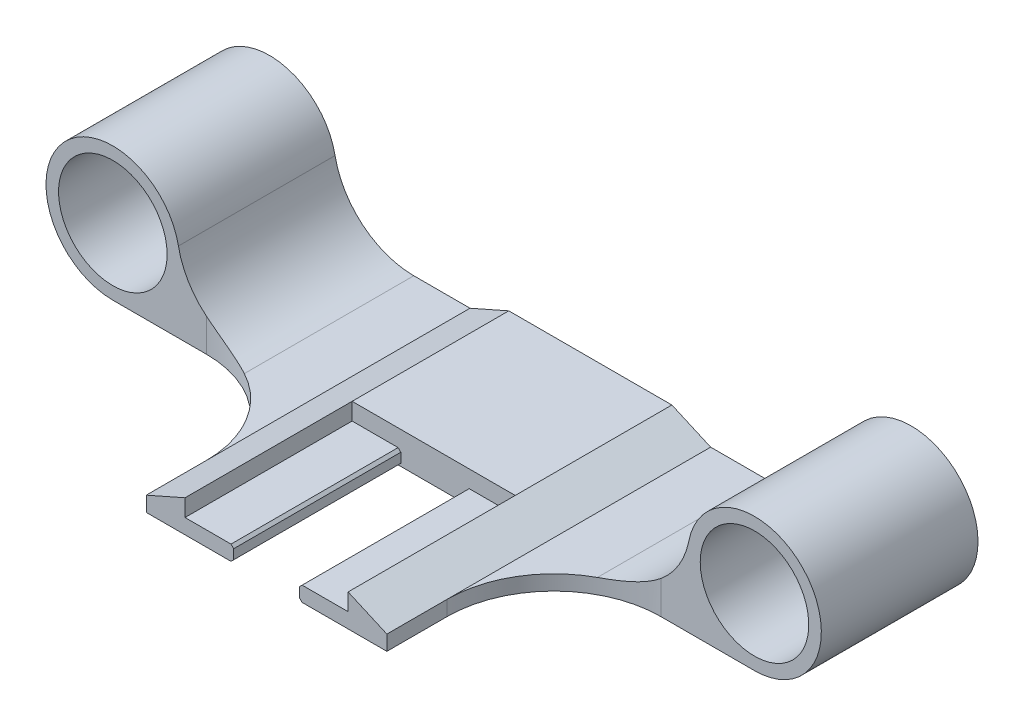
ISO-10303-21;
HEADER;
FILE_DESCRIPTION(('STEP AP214'),'2;1');
FILE_NAME('part.step','',(''),(''),'','','');
FILE_SCHEMA(('AUTOMOTIVE_DESIGN { 1 0 10303 214 1 1 1 1 }'));
ENDSEC;
DATA;
#1=APPLICATION_CONTEXT('core data for automotive mechanical design processes');
#2=APPLICATION_PROTOCOL_DEFINITION('international standard','automotive_design',2000,#1);
#3=PRODUCT_CONTEXT('',#1,'mechanical');
#4=PRODUCT('Part','Part','',(#3));
#5=PRODUCT_RELATED_PRODUCT_CATEGORY('part','',(#4));
#6=PRODUCT_DEFINITION_FORMATION('','',#4);
#7=PRODUCT_DEFINITION_CONTEXT('part definition',#1,'design');
#8=PRODUCT_DEFINITION('design','',#6,#7);
#9=PRODUCT_DEFINITION_SHAPE('','',#8);
#10=(LENGTH_UNIT() NAMED_UNIT(*) SI_UNIT(.MILLI.,.METRE.));
#11=(NAMED_UNIT(*) PLANE_ANGLE_UNIT() SI_UNIT($,.RADIAN.));
#12=(NAMED_UNIT(*) SI_UNIT($,.STERADIAN.) SOLID_ANGLE_UNIT());
#13=UNCERTAINTY_MEASURE_WITH_UNIT(LENGTH_MEASURE(1.E-05),#10,'distance_accuracy_value','');
#14=(GEOMETRIC_REPRESENTATION_CONTEXT(3) GLOBAL_UNCERTAINTY_ASSIGNED_CONTEXT((#13)) GLOBAL_UNIT_ASSIGNED_CONTEXT((#10,
#11,#12)) REPRESENTATION_CONTEXT('',''));
#15=CARTESIAN_POINT('',(0.,0.,0.));
#16=DIRECTION('',(0.,0.,1.));
#17=DIRECTION('',(1.,0.,0.));
#18=AXIS2_PLACEMENT_3D('',#15,#16,#17);
#19=CARTESIAN_POINT('',(22.5,-1.4,31.25));
#20=DIRECTION('',(-1.,0.,0.));
#21=DIRECTION('',(0.,0.,1.));
#22=AXIS2_PLACEMENT_3D('',#19,#20,#21);
#23=PLANE('',#22);
#24=DIRECTION('',(0.,0.,-1.));
#25=VECTOR('',#24,1.);
#26=CARTESIAN_POINT('',(22.5,-1.4,31.25));
#27=LINE('',#26,#25);
#28=CARTESIAN_POINT('',(22.5,-1.4,31.25));
#29=VERTEX_POINT('',#28);
#30=CARTESIAN_POINT('',(22.5,-1.4,20.));
#31=VERTEX_POINT('',#30);
#32=EDGE_CURVE('E409',#29,#31,#27,.T.);
#33=ORIENTED_EDGE('',*,*,#32,.T.);
#34=DIRECTION('',(0.,-1.,0.));
#35=VECTOR('',#34,1.);
#36=CARTESIAN_POINT('',(22.5,-1.4,20.));
#37=LINE('',#36,#35);
#38=CARTESIAN_POINT('',(22.5,1.4,20.));
#39=VERTEX_POINT('',#38);
#40=EDGE_CURVE('E432',#31,#39,#37,.F.);
#41=ORIENTED_EDGE('',*,*,#40,.T.);
#42=DIRECTION('',(0.,0.,-1.));
#43=VECTOR('',#42,1.);
#44=CARTESIAN_POINT('',(22.5,1.4,31.25));
#45=LINE('',#44,#43);
#46=CARTESIAN_POINT('',(22.5,1.4,31.25));
#47=VERTEX_POINT('',#46);
#48=EDGE_CURVE('E396',#47,#39,#45,.T.);
#49=ORIENTED_EDGE('',*,*,#48,.F.);
#50=DIRECTION('',(0.,1.,0.));
#51=VECTOR('',#50,1.);
#52=CARTESIAN_POINT('',(22.5,-1.4,31.25));
#53=LINE('',#52,#51);
#54=EDGE_CURVE('E393',#29,#47,#53,.T.);
#55=ORIENTED_EDGE('',*,*,#54,.F.);
#56=EDGE_LOOP('',(#33,#41,#49,#55));
#57=FACE_BOUND('',#56,.T.);
#58=ADVANCED_FACE('F41',(#57),#23,.F.);
#59=CARTESIAN_POINT('',(-22.5,-1.4,-29.3));
#60=DIRECTION('',(-1.,0.,0.));
#61=DIRECTION('',(0.,0.,1.));
#62=AXIS2_PLACEMENT_3D('',#59,#60,#61);
#63=PLANE('',#62);
#64=DIRECTION('',(0.,0.,1.));
#65=VECTOR('',#64,1.);
#66=CARTESIAN_POINT('',(-22.5,1.4,-29.3));
#67=LINE('',#66,#65);
#68=CARTESIAN_POINT('',(-22.5,1.4,20.));
#69=VERTEX_POINT('',#68);
#70=CARTESIAN_POINT('',(-22.5,1.4,31.25));
#71=VERTEX_POINT('',#70);
#72=EDGE_CURVE('E371',#69,#71,#67,.T.);
#73=ORIENTED_EDGE('',*,*,#72,.F.);
#74=DIRECTION('',(0.,-1.,0.));
#75=VECTOR('',#74,1.);
#76=CARTESIAN_POINT('',(-22.5,-1.4,20.));
#77=LINE('',#76,#75);
#78=CARTESIAN_POINT('',(-22.5,-1.4,20.));
#79=VERTEX_POINT('',#78);
#80=EDGE_CURVE('E421',#69,#79,#77,.T.);
#81=ORIENTED_EDGE('',*,*,#80,.T.);
#82=DIRECTION('',(0.,0.,1.));
#83=VECTOR('',#82,1.);
#84=CARTESIAN_POINT('',(-22.5,-1.4,-29.3));
#85=LINE('',#84,#83);
#86=CARTESIAN_POINT('',(-22.5,-1.4,31.25));
#87=VERTEX_POINT('',#86);
#88=EDGE_CURVE('E365',#79,#87,#85,.T.);
#89=ORIENTED_EDGE('',*,*,#88,.T.);
#90=DIRECTION('',(0.,-1.,0.));
#91=VECTOR('',#90,1.);
#92=CARTESIAN_POINT('',(-22.5,-1.4,31.25));
#93=LINE('',#92,#91);
#94=EDGE_CURVE('E299',#71,#87,#93,.T.);
#95=ORIENTED_EDGE('',*,*,#94,.F.);
#96=EDGE_LOOP('',(#73,#81,#89,#95));
#97=FACE_BOUND('',#96,.T.);
#98=ADVANCED_FACE('F508',(#97),#63,.T.);
#99=CARTESIAN_POINT('',(0.,0.,0.));
#100=DIRECTION('',(0.,0.,-1.));
#101=DIRECTION('',(-1.,0.,0.));
#102=AXIS2_PLACEMENT_3D('',#99,#100,#101);
#103=PLANE('',#102);
#104=DIRECTION('',(0.,1.,0.));
#105=VECTOR('',#104,1.);
#106=CARTESIAN_POINT('',(-6.15,-1.4,0.));
#107=LINE('',#106,#105);
#108=CARTESIAN_POINT('',(-6.15,-0.899999999999999,0.));
#109=VERTEX_POINT('',#108);
#110=CARTESIAN_POINT('',(-6.15,0.9,0.));
#111=VERTEX_POINT('',#110);
#112=EDGE_CURVE('E292',#109,#111,#107,.T.);
#113=ORIENTED_EDGE('',*,*,#112,.F.);
#114=DIRECTION('',(0.707106781186548,0.707106781186547,0.));
#115=VECTOR('',#114,1.);
#116=CARTESIAN_POINT('',(-2.625,2.625,0.));
#117=LINE('',#116,#115);
#118=CARTESIAN_POINT('',(-6.65,-1.4,0.));
#119=VERTEX_POINT('',#118);
#120=EDGE_CURVE('E584',#109,#119,#117,.F.);
#121=ORIENTED_EDGE('',*,*,#120,.T.);
#122=DIRECTION('',(1.,0.,0.));
#123=VECTOR('',#122,1.);
#124=CARTESIAN_POINT('',(22.5,-1.4,0.));
#125=LINE('',#124,#123);
#126=CARTESIAN_POINT('',(6.65000000000001,-1.4,0.));
#127=VERTEX_POINT('',#126);
#128=EDGE_CURVE('E345',#119,#127,#125,.T.);
#129=ORIENTED_EDGE('',*,*,#128,.T.);
#130=DIRECTION('',(0.707106781186548,-0.707106781186548,0.));
#131=VECTOR('',#130,1.);
#132=CARTESIAN_POINT('',(2.625,2.625,0.));
#133=LINE('',#132,#131);
#134=CARTESIAN_POINT('',(6.15,-0.899999999999999,0.));
#135=VERTEX_POINT('',#134);
#136=EDGE_CURVE('E581',#127,#135,#133,.F.);
#137=ORIENTED_EDGE('',*,*,#136,.T.);
#138=DIRECTION('',(0.,-1.,0.));
#139=VECTOR('',#138,1.);
#140=CARTESIAN_POINT('',(6.15,-1.4,0.));
#141=LINE('',#140,#139);
#142=CARTESIAN_POINT('',(6.15,0.9,0.));
#143=VERTEX_POINT('',#142);
#144=EDGE_CURVE('E379',#143,#135,#141,.T.);
#145=ORIENTED_EDGE('',*,*,#144,.F.);
#146=DIRECTION('',(-0.707106781186548,-0.707106781186547,0.));
#147=VECTOR('',#146,1.);
#148=CARTESIAN_POINT('',(2.625,-2.625,0.));
#149=LINE('',#148,#147);
#150=CARTESIAN_POINT('',(6.65,1.4,0.));
#151=VERTEX_POINT('',#150);
#152=EDGE_CURVE('E50',#143,#151,#149,.F.);
#153=ORIENTED_EDGE('',*,*,#152,.T.);
#154=DIRECTION('',(-1.,0.,0.));
#155=VECTOR('',#154,1.);
#156=CARTESIAN_POINT('',(6.15,1.4,0.));
#157=LINE('',#156,#155);
#158=CARTESIAN_POINT('',(15.25,1.4,0.));
#159=VERTEX_POINT('',#158);
#160=EDGE_CURVE('E400',#159,#151,#157,.T.);
#161=ORIENTED_EDGE('',*,*,#160,.F.);
#162=DIRECTION('',(0.,-1.,0.));
#163=VECTOR('',#162,1.);
#164=CARTESIAN_POINT('',(15.25,1.4,0.));
#165=LINE('',#164,#163);
#166=CARTESIAN_POINT('',(15.25,4.6,0.));
#167=VERTEX_POINT('',#166);
#168=EDGE_CURVE('E364',#167,#159,#165,.T.);
#169=ORIENTED_EDGE('',*,*,#168,.F.);
#170=DIRECTION('',(-1.,0.,0.));
#171=VECTOR('',#170,1.);
#172=CARTESIAN_POINT('',(15.25,4.6,0.));
#173=LINE('',#172,#171);
#174=CARTESIAN_POINT('',(-15.25,4.6,0.));
#175=VERTEX_POINT('',#174);
#176=EDGE_CURVE('E339',#167,#175,#173,.T.);
#177=ORIENTED_EDGE('',*,*,#176,.T.);
#178=DIRECTION('',(0.,1.,0.));
#179=VECTOR('',#178,1.);
#180=CARTESIAN_POINT('',(-15.25,1.4,0.));
#181=LINE('',#180,#179);
#182=CARTESIAN_POINT('',(-15.25,1.4,0.));
#183=VERTEX_POINT('',#182);
#184=EDGE_CURVE('E304',#183,#175,#181,.T.);
#185=ORIENTED_EDGE('',*,*,#184,.F.);
#186=DIRECTION('',(-1.,0.,0.));
#187=VECTOR('',#186,1.);
#188=CARTESIAN_POINT('',(-15.25,1.4,0.));
#189=LINE('',#188,#187);
#190=CARTESIAN_POINT('',(-6.65,1.4,0.));
#191=VERTEX_POINT('',#190);
#192=EDGE_CURVE('E326',#191,#183,#189,.T.);
#193=ORIENTED_EDGE('',*,*,#192,.F.);
#194=DIRECTION('',(-0.707106781186548,0.707106781186547,0.));
#195=VECTOR('',#194,1.);
#196=CARTESIAN_POINT('',(-2.62499999999999,-2.625,0.));
#197=LINE('',#196,#195);
#198=EDGE_CURVE('E11',#191,#111,#197,.F.);
#199=ORIENTED_EDGE('',*,*,#198,.T.);
#200=EDGE_LOOP('',(#113,#121,#129,#137,#145,#153,#161,#169,#177,#185,#193,#199));
#201=FACE_BOUND('',#200,.T.);
#202=ADVANCED_FACE('F514',(#201),#103,.F.);
#203=CARTESIAN_POINT('',(15.25,4.6,31.25));
#204=DIRECTION('',(-0.403795534848537,-0.914849258641217,0.));
#205=DIRECTION('',(0.914849258641217,-0.403795534848537,0.));
#206=AXIS2_PLACEMENT_3D('',#203,#204,#205);
#207=PLANE('',#206);
#208=ORIENTED_EDGE('',*,*,#48,.T.);
#209=DIRECTION('',(0.,0.,1.));
#210=VECTOR('',#209,1.);
#211=CARTESIAN_POINT('',(22.5,1.4,-85.2016994374947));
#212=LINE('',#211,#210);
#213=CARTESIAN_POINT('',(22.5,1.4,-29.3));
#214=VERTEX_POINT('',#213);
#215=EDGE_CURVE('E244',#214,#39,#212,.T.);
#216=ORIENTED_EDGE('',*,*,#215,.F.);
#217=DIRECTION('',(-0.914849258641216,0.403795534848539,0.));
#218=VECTOR('',#217,1.);
#219=CARTESIAN_POINT('',(22.5,1.4,-29.3));
#220=LINE('',#219,#218);
#221=CARTESIAN_POINT('',(15.25,4.6,-29.3));
#222=VERTEX_POINT('',#221);
#223=EDGE_CURVE('E222',#214,#222,#220,.T.);
#224=ORIENTED_EDGE('',*,*,#223,.T.);
#225=DIRECTION('',(0.,0.,1.));
#226=VECTOR('',#225,1.);
#227=CARTESIAN_POINT('',(15.25,4.6,-29.3));
#228=LINE('',#227,#226);
#229=EDGE_CURVE('E360',#222,#167,#228,.T.);
#230=ORIENTED_EDGE('',*,*,#229,.T.);
#231=DIRECTION('',(0.,0.,-1.));
#232=VECTOR('',#231,1.);
#233=CARTESIAN_POINT('',(15.25,4.6,31.25));
#234=LINE('',#233,#232);
#235=CARTESIAN_POINT('',(15.25,4.6,31.25));
#236=VERTEX_POINT('',#235);
#237=EDGE_CURVE('E417',#236,#167,#234,.T.);
#238=ORIENTED_EDGE('',*,*,#237,.F.);
#239=DIRECTION('',(-0.914849258641217,0.403795534848537,0.));
#240=VECTOR('',#239,1.);
#241=CARTESIAN_POINT('',(15.25,4.6,31.25));
#242=LINE('',#241,#240);
#243=EDGE_CURVE('E374',#47,#236,#242,.T.);
#244=ORIENTED_EDGE('',*,*,#243,.F.);
#245=EDGE_LOOP('',(#208,#216,#224,#230,#238,#244));
#246=FACE_BOUND('',#245,.T.);
#247=ADVANCED_FACE('F463',(#246),#207,.F.);
#248=CARTESIAN_POINT('',(15.25,1.4,31.25));
#249=DIRECTION('',(1.,0.,0.));
#250=DIRECTION('',(0.,0.,-1.));
#251=AXIS2_PLACEMENT_3D('',#248,#249,#250);
#252=PLANE('',#251);
#253=ORIENTED_EDGE('',*,*,#168,.T.);
#254=DIRECTION('',(0.,0.,-1.));
#255=VECTOR('',#254,1.);
#256=CARTESIAN_POINT('',(15.25,1.4,31.25));
#257=LINE('',#256,#255);
#258=CARTESIAN_POINT('',(15.25,1.4,31.25));
#259=VERTEX_POINT('',#258);
#260=EDGE_CURVE('E413',#259,#159,#257,.T.);
#261=ORIENTED_EDGE('',*,*,#260,.F.);
#262=DIRECTION('',(0.,-1.,0.));
#263=VECTOR('',#262,1.);
#264=CARTESIAN_POINT('',(15.25,1.4,31.25));
#265=LINE('',#264,#263);
#266=EDGE_CURVE('E378',#236,#259,#265,.T.);
#267=ORIENTED_EDGE('',*,*,#266,.F.);
#268=ORIENTED_EDGE('',*,*,#237,.T.);
#269=EDGE_LOOP('',(#253,#261,#267,#268));
#270=FACE_BOUND('',#269,.T.);
#271=ADVANCED_FACE('F531',(#270),#252,.F.);
#272=CARTESIAN_POINT('',(6.15,1.4,31.25));
#273=DIRECTION('',(0.,-1.,0.));
#274=DIRECTION('',(0.,0.,-1.));
#275=AXIS2_PLACEMENT_3D('',#272,#273,#274);
#276=PLANE('',#275);
#277=ORIENTED_EDGE('',*,*,#160,.T.);
#278=DIRECTION('',(0.,0.,1.));
#279=VECTOR('',#278,1.);
#280=CARTESIAN_POINT('',(6.65,1.4,31.25));
#281=LINE('',#280,#279);
#282=CARTESIAN_POINT('',(6.65,1.4,31.25));
#283=VERTEX_POINT('',#282);
#284=EDGE_CURVE('E543',#151,#283,#281,.T.);
#285=ORIENTED_EDGE('',*,*,#284,.T.);
#286=DIRECTION('',(-1.,0.,0.));
#287=VECTOR('',#286,1.);
#288=CARTESIAN_POINT('',(6.15,1.4,31.25));
#289=LINE('',#288,#287);
#290=EDGE_CURVE('E382',#259,#283,#289,.T.);
#291=ORIENTED_EDGE('',*,*,#290,.F.);
#292=ORIENTED_EDGE('',*,*,#260,.T.);
#293=EDGE_LOOP('',(#277,#285,#291,#292));
#294=FACE_BOUND('',#293,.T.);
#295=ADVANCED_FACE('F528',(#294),#276,.F.);
#296=CARTESIAN_POINT('',(6.15,-1.4,31.25));
#297=DIRECTION('',(1.,0.,0.));
#298=DIRECTION('',(0.,0.,-1.));
#299=AXIS2_PLACEMENT_3D('',#296,#297,#298);
#300=PLANE('',#299);
#301=ORIENTED_EDGE('',*,*,#144,.T.);
#302=DIRECTION('',(0.,0.,1.));
#303=VECTOR('',#302,1.);
#304=CARTESIAN_POINT('',(6.15,-0.899999999999999,31.25));
#305=LINE('',#304,#303);
#306=CARTESIAN_POINT('',(6.15,-0.899999999999999,31.25));
#307=VERTEX_POINT('',#306);
#308=EDGE_CURVE('E555',#135,#307,#305,.T.);
#309=ORIENTED_EDGE('',*,*,#308,.T.);
#310=DIRECTION('',(0.,-1.,0.));
#311=VECTOR('',#310,1.);
#312=CARTESIAN_POINT('',(6.15,-1.4,31.25));
#313=LINE('',#312,#311);
#314=CARTESIAN_POINT('',(6.15,0.9,31.25));
#315=VERTEX_POINT('',#314);
#316=EDGE_CURVE('E386',#315,#307,#313,.T.);
#317=ORIENTED_EDGE('',*,*,#316,.F.);
#318=DIRECTION('',(0.,0.,-1.));
#319=VECTOR('',#318,1.);
#320=CARTESIAN_POINT('',(6.15,0.9,31.25));
#321=LINE('',#320,#319);
#322=EDGE_CURVE('E552',#315,#143,#321,.T.);
#323=ORIENTED_EDGE('',*,*,#322,.T.);
#324=EDGE_LOOP('',(#301,#309,#317,#323));
#325=FACE_BOUND('',#324,.T.);
#326=ADVANCED_FACE('F524',(#325),#300,.F.);
#327=CARTESIAN_POINT('',(6.15,-1.4,31.25));
#328=DIRECTION('',(0.,1.,0.));
#329=DIRECTION('',(0.,0.,1.));
#330=AXIS2_PLACEMENT_3D('',#327,#328,#329);
#331=PLANE('',#330);
#332=DIRECTION('',(1.,0.,0.));
#333=VECTOR('',#332,1.);
#334=CARTESIAN_POINT('',(6.15,-1.4,31.25));
#335=LINE('',#334,#333);
#336=CARTESIAN_POINT('',(6.65,-1.4,31.25));
#337=VERTEX_POINT('',#336);
#338=EDGE_CURVE('E390',#337,#29,#335,.T.);
#339=ORIENTED_EDGE('',*,*,#338,.F.);
#340=DIRECTION('',(0.,0.,-1.));
#341=VECTOR('',#340,1.);
#342=CARTESIAN_POINT('',(6.65,-1.4,31.25));
#343=LINE('',#342,#341);
#344=EDGE_CURVE('E597',#337,#127,#343,.T.);
#345=ORIENTED_EDGE('',*,*,#344,.T.);
#346=ORIENTED_EDGE('',*,*,#128,.F.);
#347=DIRECTION('',(0.,0.,1.));
#348=VECTOR('',#347,1.);
#349=CARTESIAN_POINT('',(-6.65,-1.4,31.25));
#350=LINE('',#349,#348);
#351=CARTESIAN_POINT('',(-6.65,-1.4,31.25));
#352=VERTEX_POINT('',#351);
#353=EDGE_CURVE('E481',#119,#352,#350,.T.);
#354=ORIENTED_EDGE('',*,*,#353,.T.);
#355=DIRECTION('',(1.,0.,0.));
#356=VECTOR('',#355,1.);
#357=CARTESIAN_POINT('',(-22.5,-1.4,31.25));
#358=LINE('',#357,#356);
#359=EDGE_CURVE('E303',#87,#352,#358,.T.);
#360=ORIENTED_EDGE('',*,*,#359,.F.);
#361=ORIENTED_EDGE('',*,*,#88,.F.);
#362=CARTESIAN_POINT('',(-42.5,-1.4,20.));
#363=DIRECTION('',(0.,1.,0.));
#364=DIRECTION('',(0.,0.,1.));
#365=AXIS2_PLACEMENT_3D('',#362,#363,#364);
#366=CIRCLE('',#365,20.);
#367=CARTESIAN_POINT('',(-42.5,-1.4,0.));
#368=VERTEX_POINT('',#367);
#369=EDGE_CURVE('E436',#79,#368,#366,.T.);
#370=ORIENTED_EDGE('',*,*,#369,.T.);
#371=DIRECTION('',(1.,0.,0.));
#372=VECTOR('',#371,1.);
#373=CARTESIAN_POINT('',(0.,-1.4,0.));
#374=LINE('',#373,#372);
#375=CARTESIAN_POINT('',(-60.,-1.4,0.));
#376=VERTEX_POINT('',#375);
#377=EDGE_CURVE('E265',#376,#368,#374,.T.);
#378=ORIENTED_EDGE('',*,*,#377,.F.);
#379=DIRECTION('',(0.,0.,1.));
#380=VECTOR('',#379,1.);
#381=CARTESIAN_POINT('',(-60.,-1.4,-85.2016994374947));
#382=LINE('',#381,#380);
#383=CARTESIAN_POINT('',(-60.,-1.4,-29.3));
#384=VERTEX_POINT('',#383);
#385=EDGE_CURVE('E264',#384,#376,#382,.T.);
#386=ORIENTED_EDGE('',*,*,#385,.F.);
#387=DIRECTION('',(1.,0.,0.));
#388=VECTOR('',#387,1.);
#389=CARTESIAN_POINT('',(22.5,-1.4,-29.3));
#390=LINE('',#389,#388);
#391=CARTESIAN_POINT('',(60.,-1.4,-29.3));
#392=VERTEX_POINT('',#391);
#393=EDGE_CURVE('E349',#384,#392,#390,.T.);
#394=ORIENTED_EDGE('',*,*,#393,.T.);
#395=DIRECTION('',(0.,0.,1.));
#396=VECTOR('',#395,1.);
#397=CARTESIAN_POINT('',(60.,-1.4,-85.2016994374947));
#398=LINE('',#397,#396);
#399=CARTESIAN_POINT('',(60.,-1.4,0.));
#400=VERTEX_POINT('',#399);
#401=EDGE_CURVE('E249',#392,#400,#398,.T.);
#402=ORIENTED_EDGE('',*,*,#401,.T.);
#403=DIRECTION('',(-1.,0.,0.));
#404=VECTOR('',#403,1.);
#405=CARTESIAN_POINT('',(0.,-1.4,0.));
#406=LINE('',#405,#404);
#407=CARTESIAN_POINT('',(42.5,-1.4,0.));
#408=VERTEX_POINT('',#407);
#409=EDGE_CURVE('E901',#400,#408,#406,.T.);
#410=ORIENTED_EDGE('',*,*,#409,.T.);
#411=CARTESIAN_POINT('',(42.5,-1.4,20.));
#412=DIRECTION('',(0.,1.,0.));
#413=DIRECTION('',(0.,0.,1.));
#414=AXIS2_PLACEMENT_3D('',#411,#412,#413);
#415=CIRCLE('',#414,20.);
#416=EDGE_CURVE('E609',#408,#31,#415,.T.);
#417=ORIENTED_EDGE('',*,*,#416,.T.);
#418=ORIENTED_EDGE('',*,*,#32,.F.);
#419=EDGE_LOOP('',(#339,#345,#346,#354,#360,#361,#370,#378,#386,#394,#402,#410,#417,#418));
#420=FACE_BOUND('',#419,.T.);
#421=ADVANCED_FACE('F521',(#420),#331,.F.);
#422=CARTESIAN_POINT('',(0.,0.,31.25));
#423=DIRECTION('',(0.,0.,1.));
#424=DIRECTION('',(1.,0.,0.));
#425=AXIS2_PLACEMENT_3D('',#422,#423,#424);
#426=PLANE('',#425);
#427=ORIENTED_EDGE('',*,*,#316,.T.);
#428=DIRECTION('',(-0.707106781186548,0.707106781186548,0.));
#429=VECTOR('',#428,1.);
#430=CARTESIAN_POINT('',(2.625,2.625,31.25));
#431=LINE('',#430,#429);
#432=EDGE_CURVE('E554',#307,#337,#431,.F.);
#433=ORIENTED_EDGE('',*,*,#432,.T.);
#434=ORIENTED_EDGE('',*,*,#338,.T.);
#435=ORIENTED_EDGE('',*,*,#54,.T.);
#436=ORIENTED_EDGE('',*,*,#243,.T.);
#437=ORIENTED_EDGE('',*,*,#266,.T.);
#438=ORIENTED_EDGE('',*,*,#290,.T.);
#439=DIRECTION('',(0.707106781186548,0.707106781186547,0.));
#440=VECTOR('',#439,1.);
#441=CARTESIAN_POINT('',(2.625,-2.625,31.25));
#442=LINE('',#441,#440);
#443=EDGE_CURVE('E546',#283,#315,#442,.F.);
#444=ORIENTED_EDGE('',*,*,#443,.T.);
#445=EDGE_LOOP('',(#427,#433,#434,#435,#436,#437,#438,#444));
#446=FACE_BOUND('',#445,.T.);
#447=ADVANCED_FACE('F519',(#446),#426,.T.);
#448=CARTESIAN_POINT('',(15.25,4.6,-29.3));
#449=DIRECTION('',(0.,1.,0.));
#450=DIRECTION('',(0.,0.,1.));
#451=AXIS2_PLACEMENT_3D('',#448,#449,#450);
#452=PLANE('',#451);
#453=ORIENTED_EDGE('',*,*,#176,.F.);
#454=ORIENTED_EDGE('',*,*,#229,.F.);
#455=DIRECTION('',(-1.,0.,0.));
#456=VECTOR('',#455,1.);
#457=CARTESIAN_POINT('',(15.25,4.6,-29.3));
#458=LINE('',#457,#456);
#459=CARTESIAN_POINT('',(-15.25,4.6,-29.3));
#460=VERTEX_POINT('',#459);
#461=EDGE_CURVE('E340',#222,#460,#458,.T.);
#462=ORIENTED_EDGE('',*,*,#461,.T.);
#463=DIRECTION('',(0.,0.,1.));
#464=VECTOR('',#463,1.);
#465=CARTESIAN_POINT('',(-15.25,4.6,-29.3));
#466=LINE('',#465,#464);
#467=EDGE_CURVE('E354',#460,#175,#466,.T.);
#468=ORIENTED_EDGE('',*,*,#467,.T.);
#469=EDGE_LOOP('',(#453,#454,#462,#468));
#470=FACE_BOUND('',#469,.T.);
#471=ADVANCED_FACE('F615',(#470),#452,.T.);
#472=CARTESIAN_POINT('',(-15.25,4.6,-29.3));
#473=DIRECTION('',(-0.403795534848536,0.914849258641217,0.));
#474=DIRECTION('',(-0.914849258641217,-0.403795534848536,0.));
#475=AXIS2_PLACEMENT_3D('',#472,#473,#474);
#476=PLANE('',#475);
#477=CARTESIAN_POINT('',(-22.5,1.4,-29.3));
#478=VERTEX_POINT('',#477);
#479=EDGE_CURVE('E368',#478,#69,#67,.T.);
#480=ORIENTED_EDGE('',*,*,#479,.T.);
#481=ORIENTED_EDGE('',*,*,#72,.T.);
#482=DIRECTION('',(-0.914849258641217,-0.403795534848537,0.));
#483=VECTOR('',#482,1.);
#484=CARTESIAN_POINT('',(-15.25,4.6,31.25));
#485=LINE('',#484,#483);
#486=CARTESIAN_POINT('',(-15.25,4.6,31.25));
#487=VERTEX_POINT('',#486);
#488=EDGE_CURVE('E318',#487,#71,#485,.T.);
#489=ORIENTED_EDGE('',*,*,#488,.F.);
#490=DIRECTION('',(0.,0.,-1.));
#491=VECTOR('',#490,1.);
#492=CARTESIAN_POINT('',(-15.25,4.6,31.25));
#493=LINE('',#492,#491);
#494=EDGE_CURVE('E322',#487,#175,#493,.T.);
#495=ORIENTED_EDGE('',*,*,#494,.T.);
#496=ORIENTED_EDGE('',*,*,#467,.F.);
#497=DIRECTION('',(-0.914849258641217,-0.403795534848536,0.));
#498=VECTOR('',#497,1.);
#499=CARTESIAN_POINT('',(-15.25,4.6,-29.3));
#500=LINE('',#499,#498);
#501=EDGE_CURVE('E344',#460,#478,#500,.T.);
#502=ORIENTED_EDGE('',*,*,#501,.T.);
#503=EDGE_LOOP('',(#480,#481,#489,#495,#496,#502));
#504=FACE_BOUND('',#503,.T.);
#505=ADVANCED_FACE('F625',(#504),#476,.T.);
#506=CARTESIAN_POINT('',(0.,0.,-29.3));
#507=DIRECTION('',(0.,0.,-1.));
#508=DIRECTION('',(-1.,0.,0.));
#509=AXIS2_PLACEMENT_3D('',#506,#507,#508);
#510=PLANE('',#509);
#511=ORIENTED_EDGE('',*,*,#461,.F.);
#512=ORIENTED_EDGE('',*,*,#223,.F.);
#513=DIRECTION('',(-1.,0.,0.));
#514=VECTOR('',#513,1.);
#515=CARTESIAN_POINT('',(0.,1.4,-29.3));
#516=LINE('',#515,#514);
#517=CARTESIAN_POINT('',(33.0155600391633,1.4,-29.3));
#518=VERTEX_POINT('',#517);
#519=EDGE_CURVE('E213',#518,#214,#516,.T.);
#520=ORIENTED_EDGE('',*,*,#519,.F.);
#521=CARTESIAN_POINT('',(33.0155600391633,16.4,-29.3));
#522=DIRECTION('',(0.,0.,-1.));
#523=DIRECTION('',(-1.,0.,0.));
#524=AXIS2_PLACEMENT_3D('',#521,#522,#523);
#525=CIRCLE('',#524,15.);
#526=CARTESIAN_POINT('',(47.734345472347,13.5090909090909,-29.3));
#527=VERTEX_POINT('',#526);
#528=EDGE_CURVE('E219',#527,#518,#525,.T.);
#529=ORIENTED_EDGE('',*,*,#528,.F.);
#530=CARTESIAN_POINT('',(60.,11.1,-29.3));
#531=DIRECTION('',(0.,0.,-1.));
#532=DIRECTION('',(-1.,0.,0.));
#533=AXIS2_PLACEMENT_3D('',#530,#531,#532);
#534=CIRCLE('',#533,12.5);
#535=EDGE_CURVE('E226',#527,#392,#534,.T.);
#536=ORIENTED_EDGE('',*,*,#535,.T.);
#537=ORIENTED_EDGE('',*,*,#393,.F.);
#538=CARTESIAN_POINT('',(-60.,11.1,-29.3));
#539=DIRECTION('',(0.,0.,-1.));
#540=DIRECTION('',(-1.,0.,0.));
#541=AXIS2_PLACEMENT_3D('',#538,#539,#540);
#542=CIRCLE('',#541,12.5);
#543=CARTESIAN_POINT('',(-47.734345472347,13.5090909090909,-29.3));
#544=VERTEX_POINT('',#543);
#545=EDGE_CURVE('E283',#544,#384,#542,.F.);
#546=ORIENTED_EDGE('',*,*,#545,.F.);
#547=CARTESIAN_POINT('',(-33.0155600391633,16.4,-29.3));
#548=DIRECTION('',(0.,0.,-1.));
#549=DIRECTION('',(-1.,0.,0.));
#550=AXIS2_PLACEMENT_3D('',#547,#548,#549);
#551=CIRCLE('',#550,15.);
#552=CARTESIAN_POINT('',(-33.0155600391633,1.4,-29.3));
#553=VERTEX_POINT('',#552);
#554=EDGE_CURVE('E282',#544,#553,#551,.F.);
#555=ORIENTED_EDGE('',*,*,#554,.T.);
#556=DIRECTION('',(1.,0.,0.));
#557=VECTOR('',#556,1.);
#558=CARTESIAN_POINT('',(0.,1.4,-29.3));
#559=LINE('',#558,#557);
#560=EDGE_CURVE('E289',#553,#478,#559,.T.);
#561=ORIENTED_EDGE('',*,*,#560,.T.);
#562=ORIENTED_EDGE('',*,*,#501,.F.);
#563=EDGE_LOOP('',(#511,#512,#520,#529,#536,#537,#546,#555,#561,#562));
#564=FACE_BOUND('',#563,.T.);
#565=CARTESIAN_POINT('',(-60.,11.1,-29.3));
#566=DIRECTION('',(0.,0.,-1.));
#567=DIRECTION('',(-1.,0.,0.));
#568=AXIS2_PLACEMENT_3D('',#565,#566,#567);
#569=CIRCLE('',#568,10.15);
#570=CARTESIAN_POINT('',(-70.15,11.1,-29.3));
#571=VERTEX_POINT('',#570);
#572=EDGE_CURVE('E269',#571,#571,#569,.F.);
#573=ORIENTED_EDGE('',*,*,#572,.T.);
#574=EDGE_LOOP('',(#573));
#575=FACE_BOUND('',#574,.T.);
#576=CARTESIAN_POINT('',(60.,11.1,-29.3));
#577=DIRECTION('',(0.,0.,-1.));
#578=DIRECTION('',(-1.,0.,0.));
#579=AXIS2_PLACEMENT_3D('',#576,#577,#578);
#580=CIRCLE('',#579,10.15);
#581=CARTESIAN_POINT('',(49.85,11.1,-29.3));
#582=VERTEX_POINT('',#581);
#583=EDGE_CURVE('E227',#582,#582,#580,.T.);
#584=ORIENTED_EDGE('',*,*,#583,.F.);
#585=EDGE_LOOP('',(#584));
#586=FACE_BOUND('',#585,.T.);
#587=ADVANCED_FACE('F216',(#564,#575,#586),#510,.T.);
#588=CARTESIAN_POINT('',(-6.15,-1.4,31.25));
#589=DIRECTION('',(-1.,0.,0.));
#590=DIRECTION('',(0.,0.,1.));
#591=AXIS2_PLACEMENT_3D('',#588,#589,#590);
#592=PLANE('',#591);
#593=DIRECTION('',(0.,1.,0.));
#594=VECTOR('',#593,1.);
#595=CARTESIAN_POINT('',(-6.15,-1.4,31.25));
#596=LINE('',#595,#594);
#597=CARTESIAN_POINT('',(-6.15,-0.899999999999999,31.25));
#598=VERTEX_POINT('',#597);
#599=CARTESIAN_POINT('',(-6.15,0.9,31.25));
#600=VERTEX_POINT('',#599);
#601=EDGE_CURVE('E308',#598,#600,#596,.T.);
#602=ORIENTED_EDGE('',*,*,#601,.F.);
#603=DIRECTION('',(0.,0.,-1.));
#604=VECTOR('',#603,1.);
#605=CARTESIAN_POINT('',(-6.15,-0.899999999999999,31.25));
#606=LINE('',#605,#604);
#607=EDGE_CURVE('E566',#598,#109,#606,.T.);
#608=ORIENTED_EDGE('',*,*,#607,.T.);
#609=ORIENTED_EDGE('',*,*,#112,.T.);
#610=DIRECTION('',(0.,0.,1.));
#611=VECTOR('',#610,1.);
#612=CARTESIAN_POINT('',(-6.15,0.9,31.25));
#613=LINE('',#612,#611);
#614=EDGE_CURVE('E559',#111,#600,#613,.T.);
#615=ORIENTED_EDGE('',*,*,#614,.T.);
#616=EDGE_LOOP('',(#602,#608,#609,#615));
#617=FACE_BOUND('',#616,.T.);
#618=ADVANCED_FACE('F636',(#617),#592,.F.);
#619=CARTESIAN_POINT('',(-15.25,1.4,31.25));
#620=DIRECTION('',(0.,-1.,0.));
#621=DIRECTION('',(0.,0.,-1.));
#622=AXIS2_PLACEMENT_3D('',#619,#620,#621);
#623=PLANE('',#622);
#624=DIRECTION('',(-1.,0.,0.));
#625=VECTOR('',#624,1.);
#626=CARTESIAN_POINT('',(-15.25,1.4,31.25));
#627=LINE('',#626,#625);
#628=CARTESIAN_POINT('',(-6.65,1.4,31.25));
#629=VERTEX_POINT('',#628);
#630=CARTESIAN_POINT('',(-15.25,1.4,31.25));
#631=VERTEX_POINT('',#630);
#632=EDGE_CURVE('E312',#629,#631,#627,.T.);
#633=ORIENTED_EDGE('',*,*,#632,.F.);
#634=DIRECTION('',(0.,0.,-1.));
#635=VECTOR('',#634,1.);
#636=CARTESIAN_POINT('',(-6.65,1.4,31.25));
#637=LINE('',#636,#635);
#638=EDGE_CURVE('E578',#629,#191,#637,.T.);
#639=ORIENTED_EDGE('',*,*,#638,.T.);
#640=ORIENTED_EDGE('',*,*,#192,.T.);
#641=DIRECTION('',(0.,0.,-1.));
#642=VECTOR('',#641,1.);
#643=CARTESIAN_POINT('',(-15.25,1.4,31.25));
#644=LINE('',#643,#642);
#645=EDGE_CURVE('E335',#631,#183,#644,.T.);
#646=ORIENTED_EDGE('',*,*,#645,.F.);
#647=EDGE_LOOP('',(#633,#639,#640,#646));
#648=FACE_BOUND('',#647,.T.);
#649=ADVANCED_FACE('F639',(#648),#623,.F.);
#650=CARTESIAN_POINT('',(-15.25,1.4,31.25));
#651=DIRECTION('',(-1.,0.,0.));
#652=DIRECTION('',(0.,0.,1.));
#653=AXIS2_PLACEMENT_3D('',#650,#651,#652);
#654=PLANE('',#653);
#655=ORIENTED_EDGE('',*,*,#184,.T.);
#656=ORIENTED_EDGE('',*,*,#494,.F.);
#657=DIRECTION('',(0.,1.,0.));
#658=VECTOR('',#657,1.);
#659=CARTESIAN_POINT('',(-15.25,1.4,31.25));
#660=LINE('',#659,#658);
#661=EDGE_CURVE('E315',#631,#487,#660,.T.);
#662=ORIENTED_EDGE('',*,*,#661,.F.);
#663=ORIENTED_EDGE('',*,*,#645,.T.);
#664=EDGE_LOOP('',(#655,#656,#662,#663));
#665=FACE_BOUND('',#664,.T.);
#666=ADVANCED_FACE('F620',(#665),#654,.F.);
#667=CARTESIAN_POINT('',(0.,0.,31.25));
#668=DIRECTION('',(0.,0.,-1.));
#669=DIRECTION('',(-1.,0.,0.));
#670=AXIS2_PLACEMENT_3D('',#667,#668,#669);
#671=PLANE('',#670);
#672=ORIENTED_EDGE('',*,*,#359,.T.);
#673=DIRECTION('',(-0.707106781186548,-0.707106781186547,0.));
#674=VECTOR('',#673,1.);
#675=CARTESIAN_POINT('',(-6.15,-0.899999999999999,31.25));
#676=LINE('',#675,#674);
#677=EDGE_CURVE('E573',#352,#598,#676,.F.);
#678=ORIENTED_EDGE('',*,*,#677,.T.);
#679=ORIENTED_EDGE('',*,*,#601,.T.);
#680=DIRECTION('',(0.707106781186548,-0.707106781186547,0.));
#681=VECTOR('',#680,1.);
#682=CARTESIAN_POINT('',(-6.65,1.4,31.25));
#683=LINE('',#682,#681);
#684=EDGE_CURVE('E570',#600,#629,#683,.F.);
#685=ORIENTED_EDGE('',*,*,#684,.T.);
#686=ORIENTED_EDGE('',*,*,#632,.T.);
#687=ORIENTED_EDGE('',*,*,#661,.T.);
#688=ORIENTED_EDGE('',*,*,#488,.T.);
#689=ORIENTED_EDGE('',*,*,#94,.T.);
#690=EDGE_LOOP('',(#672,#678,#679,#685,#686,#687,#688,#689));
#691=FACE_BOUND('',#690,.T.);
#692=ADVANCED_FACE('F504',(#691),#671,.F.);
#693=CARTESIAN_POINT('',(-33.0155600391633,16.4,-85.2016994374947));
#694=DIRECTION('',(0.,0.,1.));
#695=DIRECTION('',(1.,0.,0.));
#696=AXIS2_PLACEMENT_3D('',#693,#694,#695);
#697=CYLINDRICAL_SURFACE('',#696,15.);
#698=ORIENTED_EDGE('',*,*,#554,.F.);
#699=DIRECTION('',(0.,0.,1.));
#700=VECTOR('',#699,1.);
#701=CARTESIAN_POINT('',(-47.734345472347,13.5090909090909,-85.2016994374947));
#702=LINE('',#701,#700);
#703=CARTESIAN_POINT('',(-47.734345472347,13.5090909090909,0.));
#704=VERTEX_POINT('',#703);
#705=EDGE_CURVE('E278',#544,#704,#702,.T.);
#706=ORIENTED_EDGE('',*,*,#705,.T.);
#707=CARTESIAN_POINT('',(-33.0155600391633,16.4,0.));
#708=DIRECTION('',(0.,0.,1.));
#709=DIRECTION('',(1.,0.,0.));
#710=AXIS2_PLACEMENT_3D('',#707,#708,#709);
#711=CIRCLE('',#710,15.);
#712=CARTESIAN_POINT('',(-42.5,4.77909647964997,0.));
#713=VERTEX_POINT('',#712);
#714=EDGE_CURVE('E273',#704,#713,#711,.T.);
#715=ORIENTED_EDGE('',*,*,#714,.T.);
#716=CARTESIAN_POINT('',(-42.5,4.77909647964997,0.));
#717=CARTESIAN_POINT('',(-42.3606716098282,4.66538245752429,-1.87738554055046E-07));
#718=CARTESIAN_POINT('',(-42.2193101680237,4.55418618958348,0.00145632708607709));
#719=CARTESIAN_POINT('',(-41.9327169973835,4.33697179867816,0.00753290707462302));
#720=CARTESIAN_POINT('',(-41.7874850349759,4.23095398931343,0.0121531635762126));
#721=CARTESIAN_POINT('',(-41.3462534272051,3.92086772544977,0.0311366912602872));
#722=CARTESIAN_POINT('',(-41.044764975124,3.72480471305557,0.0506228887963404));
#723=CARTESIAN_POINT('',(-40.4298860648687,3.35560447519877,0.105031027877325));
#724=CARTESIAN_POINT('',(-40.1165093556427,3.18244174637012,0.139935607086966));
#725=CARTESIAN_POINT('',(-39.4801041028155,2.85980443591726,0.226702008062476));
#726=CARTESIAN_POINT('',(-39.1570773855395,2.71032540533865,0.278560639409666));
#727=CARTESIAN_POINT('',(-38.5031013377151,2.43528983657951,0.400617590278792));
#728=CARTESIAN_POINT('',(-38.1721298145674,2.30981201100265,0.47087452164147));
#729=CARTESIAN_POINT('',(-37.5062681440015,2.08367413206313,0.630439955827655));
#730=CARTESIAN_POINT('',(-37.1713774578959,1.98301753335094,0.71975110741936));
#731=CARTESIAN_POINT('',(-36.5012136630947,1.80650297302246,0.917639384603713));
#732=CARTESIAN_POINT('',(-36.1659414533313,1.73061628111086,1.0261939627542));
#733=CARTESIAN_POINT('',(-35.4977463680141,1.60289121255456,1.26249768707404));
#734=CARTESIAN_POINT('',(-35.1648227190326,1.55104451639485,1.39024017259689));
#735=CARTESIAN_POINT('',(-34.5253298337156,1.47292579246323,1.65561112328996));
#736=CARTESIAN_POINT('',(-34.2184485098512,1.44521680198145,1.79206618067095));
#737=CARTESIAN_POINT('',(-33.7631890457755,1.41787242827444,2.00843663658665));
#738=CARTESIAN_POINT('',(-33.6123764534735,1.41112726323227,2.08245597193164));
#739=CARTESIAN_POINT('',(-33.3125639281298,1.40219093857344,2.23432360458117));
#740=CARTESIAN_POINT('',(-33.1635639021357,1.39999954444208,2.31217170449675));
#741=CARTESIAN_POINT('',(-33.0155600391633,1.4,2.39189395110071));
#742=B_SPLINE_CURVE_WITH_KNOTS('',3,(#716,#717,#718,#719,#720,#721,#722,#723,#724,#725,#726,
#727,#728,#729,#730,#731,#732,#733,#734,#735,#736,#737,#738,#739,#740,#741),.UNSPECIFIED.,.F.,
.F.,(4,2,2,2,2,2,2,2,2,2,2,2,4),(0.,0.539455957951084,1.07894454415587,2.15810282842228,
3.2360489794982,4.31379239898749,5.39501188270401,6.47638176711827,7.55649289028156,
8.63622994017261,9.64614711184699,10.1504476677144,10.6547222519586),.UNSPECIFIED.);
#743=CARTESIAN_POINT('',(-33.0155600391633,1.4,2.3918939511007));
#744=VERTEX_POINT('',#743);
#745=EDGE_CURVE('E439',#713,#744,#742,.T.);
#746=ORIENTED_EDGE('',*,*,#745,.T.);
#747=DIRECTION('',(0.,0.,1.));
#748=VECTOR('',#747,1.);
#749=CARTESIAN_POINT('',(-33.0155600391633,1.4,-85.2016994374947));
#750=LINE('',#749,#748);
#751=EDGE_CURVE('E277',#553,#744,#750,.T.);
#752=ORIENTED_EDGE('',*,*,#751,.F.);
#753=EDGE_LOOP('',(#698,#706,#715,#746,#752));
#754=FACE_BOUND('',#753,.T.);
#755=ADVANCED_FACE('F451',(#754),#697,.F.);
#756=CARTESIAN_POINT('',(0.,1.4,-85.2016994374947));
#757=DIRECTION('',(0.,-1.,0.));
#758=DIRECTION('',(0.,0.,-1.));
#759=AXIS2_PLACEMENT_3D('',#756,#757,#758);
#760=PLANE('',#759);
#761=ORIENTED_EDGE('',*,*,#560,.F.);
#762=ORIENTED_EDGE('',*,*,#751,.T.);
#763=CARTESIAN_POINT('',(-42.5,1.4,20.));
#764=DIRECTION('',(0.,-1.,0.));
#765=DIRECTION('',(0.,0.,-1.));
#766=AXIS2_PLACEMENT_3D('',#763,#764,#765);
#767=CIRCLE('',#766,20.);
#768=EDGE_CURVE('E449',#744,#69,#767,.T.);
#769=ORIENTED_EDGE('',*,*,#768,.T.);
#770=ORIENTED_EDGE('',*,*,#479,.F.);
#771=EDGE_LOOP('',(#761,#762,#769,#770));
#772=FACE_BOUND('',#771,.T.);
#773=ADVANCED_FACE('F497',(#772),#760,.F.);
#774=CARTESIAN_POINT('',(-60.,11.1,-85.2016994374947));
#775=DIRECTION('',(0.,0.,1.));
#776=DIRECTION('',(1.,0.,0.));
#777=AXIS2_PLACEMENT_3D('',#774,#775,#776);
#778=CYLINDRICAL_SURFACE('',#777,12.5);
#779=ORIENTED_EDGE('',*,*,#705,.F.);
#780=ORIENTED_EDGE('',*,*,#545,.T.);
#781=ORIENTED_EDGE('',*,*,#385,.T.);
#782=CARTESIAN_POINT('',(-60.,11.1,0.));
#783=DIRECTION('',(0.,0.,1.));
#784=DIRECTION('',(1.,0.,0.));
#785=AXIS2_PLACEMENT_3D('',#782,#783,#784);
#786=CIRCLE('',#785,12.5);
#787=EDGE_CURVE('E263',#704,#376,#786,.T.);
#788=ORIENTED_EDGE('',*,*,#787,.F.);
#789=EDGE_LOOP('',(#779,#780,#781,#788));
#790=FACE_BOUND('',#789,.T.);
#791=ADVANCED_FACE('F495',(#790),#778,.T.);
#792=CARTESIAN_POINT('',(-60.,11.1,-85.2016994374947));
#793=DIRECTION('',(0.,0.,1.));
#794=DIRECTION('',(1.,0.,0.));
#795=AXIS2_PLACEMENT_3D('',#792,#793,#794);
#796=CYLINDRICAL_SURFACE('',#795,10.15);
#797=CARTESIAN_POINT('',(-60.,11.1,0.));
#798=DIRECTION('',(0.,0.,1.));
#799=DIRECTION('',(1.,0.,0.));
#800=AXIS2_PLACEMENT_3D('',#797,#798,#799);
#801=CIRCLE('',#800,10.15);
#802=CARTESIAN_POINT('',(-49.85,11.1,0.));
#803=VERTEX_POINT('',#802);
#804=EDGE_CURVE('E259',#803,#803,#801,.T.);
#805=ORIENTED_EDGE('',*,*,#804,.T.);
#806=EDGE_LOOP('',(#805));
#807=FACE_BOUND('',#806,.T.);
#808=ORIENTED_EDGE('',*,*,#572,.F.);
#809=EDGE_LOOP('',(#808));
#810=FACE_BOUND('',#809,.T.);
#811=ADVANCED_FACE('F493',(#807,#810),#796,.F.);
#812=CARTESIAN_POINT('',(0.,0.,0.));
#813=DIRECTION('',(0.,0.,1.));
#814=DIRECTION('',(1.,0.,0.));
#815=AXIS2_PLACEMENT_3D('',#812,#813,#814);
#816=PLANE('',#815);
#817=ORIENTED_EDGE('',*,*,#377,.T.);
#818=DIRECTION('',(0.,-1.,0.));
#819=VECTOR('',#818,1.);
#820=CARTESIAN_POINT('',(-42.5,1.4,0.));
#821=LINE('',#820,#819);
#822=EDGE_CURVE('E425',#368,#713,#821,.F.);
#823=ORIENTED_EDGE('',*,*,#822,.T.);
#824=ORIENTED_EDGE('',*,*,#714,.F.);
#825=ORIENTED_EDGE('',*,*,#787,.T.);
#826=EDGE_LOOP('',(#817,#823,#824,#825));
#827=FACE_BOUND('',#826,.T.);
#828=ORIENTED_EDGE('',*,*,#804,.F.);
#829=EDGE_LOOP('',(#828));
#830=FACE_BOUND('',#829,.T.);
#831=ADVANCED_FACE('F490',(#827,#830),#816,.T.);
#832=CARTESIAN_POINT('',(0.,1.4,-85.2016994374947));
#833=DIRECTION('',(0.,1.,0.));
#834=DIRECTION('',(0.,0.,1.));
#835=AXIS2_PLACEMENT_3D('',#832,#833,#834);
#836=PLANE('',#835);
#837=DIRECTION('',(0.,0.,1.));
#838=VECTOR('',#837,1.);
#839=CARTESIAN_POINT('',(33.0155600391633,1.4,-85.2016994374947));
#840=LINE('',#839,#838);
#841=CARTESIAN_POINT('',(33.0155600391633,1.4,2.3918939511007));
#842=VERTEX_POINT('',#841);
#843=EDGE_CURVE('E231',#518,#842,#840,.T.);
#844=ORIENTED_EDGE('',*,*,#843,.F.);
#845=ORIENTED_EDGE('',*,*,#519,.T.);
#846=ORIENTED_EDGE('',*,*,#215,.T.);
#847=CARTESIAN_POINT('',(42.5,1.4,20.));
#848=DIRECTION('',(0.,1.,0.));
#849=DIRECTION('',(0.,0.,1.));
#850=AXIS2_PLACEMENT_3D('',#847,#848,#849);
#851=CIRCLE('',#850,20.);
#852=EDGE_CURVE('E241',#39,#842,#851,.F.);
#853=ORIENTED_EDGE('',*,*,#852,.T.);
#854=EDGE_LOOP('',(#844,#845,#846,#853));
#855=FACE_BOUND('',#854,.T.);
#856=ADVANCED_FACE('F239',(#855),#836,.T.);
#857=CARTESIAN_POINT('',(60.,11.1,-85.2016994374947));
#858=DIRECTION('',(0.,0.,1.));
#859=DIRECTION('',(1.,0.,0.));
#860=AXIS2_PLACEMENT_3D('',#857,#858,#859);
#861=CYLINDRICAL_SURFACE('',#860,12.5);
#862=ORIENTED_EDGE('',*,*,#535,.F.);
#863=DIRECTION('',(0.,0.,1.));
#864=VECTOR('',#863,1.);
#865=CARTESIAN_POINT('',(47.734345472347,13.5090909090909,-85.2016994374947));
#866=LINE('',#865,#864);
#867=CARTESIAN_POINT('',(47.734345472347,13.5090909090909,0.));
#868=VERTEX_POINT('',#867);
#869=EDGE_CURVE('E234',#527,#868,#866,.T.);
#870=ORIENTED_EDGE('',*,*,#869,.T.);
#871=CARTESIAN_POINT('',(60.,11.1,0.));
#872=DIRECTION('',(0.,0.,-1.));
#873=DIRECTION('',(-1.,0.,0.));
#874=AXIS2_PLACEMENT_3D('',#871,#872,#873);
#875=CIRCLE('',#874,12.5);
#876=EDGE_CURVE('E252',#868,#400,#875,.T.);
#877=ORIENTED_EDGE('',*,*,#876,.T.);
#878=ORIENTED_EDGE('',*,*,#401,.F.);
#879=EDGE_LOOP('',(#862,#870,#877,#878));
#880=FACE_BOUND('',#879,.T.);
#881=ADVANCED_FACE('F488',(#880),#861,.T.);
#882=CARTESIAN_POINT('',(33.0155600391633,16.4,-85.2016994374947));
#883=DIRECTION('',(0.,0.,1.));
#884=DIRECTION('',(1.,0.,0.));
#885=AXIS2_PLACEMENT_3D('',#882,#883,#884);
#886=CYLINDRICAL_SURFACE('',#885,15.);
#887=ORIENTED_EDGE('',*,*,#869,.F.);
#888=ORIENTED_EDGE('',*,*,#528,.T.);
#889=ORIENTED_EDGE('',*,*,#843,.T.);
#890=CARTESIAN_POINT('',(33.0155600391633,1.4,2.3918939511007));
#891=CARTESIAN_POINT('',(33.1739264213,1.39999958789887,2.30658979984037));
#892=CARTESIAN_POINT('',(33.3334318412387,1.40250862997605,2.22343246839216));
#893=CARTESIAN_POINT('',(33.6545042900788,1.4127535348759,2.06150691020341));
#894=CARTESIAN_POINT('',(33.8160714811127,1.42048981127119,1.98273903128502));
#895=CARTESIAN_POINT('',(34.303573930777,1.45185539827253,1.75314917327096));
#896=CARTESIAN_POINT('',(34.6322407882032,1.48364164861827,1.60907827131966));
#897=CARTESIAN_POINT('',(35.2937517422353,1.57026669676182,1.33995279493419));
#898=CARTESIAN_POINT('',(35.626589687284,1.62507471227146,1.21487313034116));
#899=CARTESIAN_POINT('',(36.2940528953543,1.75871335098061,0.983930994801306));
#900=CARTESIAN_POINT('',(36.6286777671712,1.83753891217254,0.878064481929904));
#901=CARTESIAN_POINT('',(37.2978849907362,2.02007027087013,0.685247457788344));
#902=CARTESIAN_POINT('',(37.6324634914685,2.12385803262589,0.598361100396081));
#903=CARTESIAN_POINT('',(38.2974108517003,2.35627854951015,0.44354833326469));
#904=CARTESIAN_POINT('',(38.6277790446336,2.48491518782349,0.375624890961158));
#905=CARTESIAN_POINT('',(39.2808558787242,2.7664978927642,0.257986635489143));
#906=CARTESIAN_POINT('',(39.6035726395644,2.91941672996472,0.208251630213008));
#907=CARTESIAN_POINT('',(40.2388075148342,3.24885228777753,0.125655071742484));
#908=CARTESIAN_POINT('',(40.551329181175,3.42536067829596,0.0927875819227791));
#909=CARTESIAN_POINT('',(41.1436635918593,3.78863428073801,0.0439795283890222));
#910=CARTESIAN_POINT('',(41.4242776272029,3.9739689992799,0.027070729136361));
#911=CARTESIAN_POINT('',(41.9723207239599,4.36299432012558,0.00507840818900347));
#912=CARTESIAN_POINT('',(42.2397695150853,4.56665607599245,-2.3370686895874E-05));
#913=CARTESIAN_POINT('',(42.5,4.77909647964994,0.));
#914=B_SPLINE_CURVE_WITH_KNOTS('',3,(#890,#891,#892,#893,#894,#895,#896,#897,#898,#899,#900,
#901,#902,#903,#904,#905,#906,#907,#908,#909,#910,#911,#912,#913),.UNSPECIFIED.,.F.,.F.,(4,2,2,
2,2,2,2,2,2,2,2,4),(0.,0.5395713648548,1.07918542496082,2.15864890159498,3.23667360449272,
4.31447125675848,5.39585740663913,6.47741268385897,7.55776358841289,8.63773399563263,
9.64692084626352,10.6545461468299),.UNSPECIFIED.);
#915=CARTESIAN_POINT('',(42.5,4.77909647964994,0.));
#916=VERTEX_POINT('',#915);
#917=EDGE_CURVE('E472',#842,#916,#914,.T.);
#918=ORIENTED_EDGE('',*,*,#917,.T.);
#919=CARTESIAN_POINT('',(33.0155600391633,16.4,0.));
#920=DIRECTION('',(0.,0.,-1.));
#921=DIRECTION('',(-1.,0.,0.));
#922=AXIS2_PLACEMENT_3D('',#919,#920,#921);
#923=CIRCLE('',#922,15.);
#924=EDGE_CURVE('E237',#868,#916,#923,.T.);
#925=ORIENTED_EDGE('',*,*,#924,.F.);
#926=EDGE_LOOP('',(#887,#888,#889,#918,#925));
#927=FACE_BOUND('',#926,.T.);
#928=ADVANCED_FACE('F230',(#927),#886,.F.);
#929=CARTESIAN_POINT('',(0.,0.,0.));
#930=DIRECTION('',(0.,0.,1.));
#931=DIRECTION('',(-1.,0.,0.));
#932=AXIS2_PLACEMENT_3D('',#929,#930,#931);
#933=PLANE('',#932);
#934=ORIENTED_EDGE('',*,*,#924,.T.);
#935=DIRECTION('',(0.,-1.,0.));
#936=VECTOR('',#935,1.);
#937=CARTESIAN_POINT('',(42.5,0.,0.));
#938=LINE('',#937,#936);
#939=EDGE_CURVE('E428',#916,#408,#938,.T.);
#940=ORIENTED_EDGE('',*,*,#939,.T.);
#941=ORIENTED_EDGE('',*,*,#409,.F.);
#942=ORIENTED_EDGE('',*,*,#876,.F.);
#943=EDGE_LOOP('',(#934,#940,#941,#942));
#944=FACE_BOUND('',#943,.T.);
#945=CARTESIAN_POINT('',(60.,11.1,0.));
#946=DIRECTION('',(0.,0.,-1.));
#947=DIRECTION('',(-1.,0.,0.));
#948=AXIS2_PLACEMENT_3D('',#945,#946,#947);
#949=CIRCLE('',#948,10.15);
#950=CARTESIAN_POINT('',(49.85,11.1,0.));
#951=VERTEX_POINT('',#950);
#952=EDGE_CURVE('E245',#951,#951,#949,.T.);
#953=ORIENTED_EDGE('',*,*,#952,.T.);
#954=EDGE_LOOP('',(#953));
#955=FACE_BOUND('',#954,.T.);
#956=ADVANCED_FACE('F487',(#944,#955),#933,.T.);
#957=CARTESIAN_POINT('',(60.,11.1,-85.2016994374947));
#958=DIRECTION('',(0.,0.,1.));
#959=DIRECTION('',(1.,0.,0.));
#960=AXIS2_PLACEMENT_3D('',#957,#958,#959);
#961=CYLINDRICAL_SURFACE('',#960,10.15);
#962=ORIENTED_EDGE('',*,*,#952,.F.);
#963=EDGE_LOOP('',(#962));
#964=FACE_BOUND('',#963,.T.);
#965=ORIENTED_EDGE('',*,*,#583,.T.);
#966=EDGE_LOOP('',(#965));
#967=FACE_BOUND('',#966,.T.);
#968=ADVANCED_FACE('F461',(#964,#967),#961,.F.);
#969=CARTESIAN_POINT('',(-42.5,-1.4,20.));
#970=DIRECTION('',(0.,1.,0.));
#971=DIRECTION('',(0.,0.,1.));
#972=AXIS2_PLACEMENT_3D('',#969,#970,#971);
#973=CYLINDRICAL_SURFACE('',#972,20.);
#974=ORIENTED_EDGE('',*,*,#745,.F.);
#975=ORIENTED_EDGE('',*,*,#822,.F.);
#976=ORIENTED_EDGE('',*,*,#369,.F.);
#977=ORIENTED_EDGE('',*,*,#80,.F.);
#978=ORIENTED_EDGE('',*,*,#768,.F.);
#979=EDGE_LOOP('',(#974,#975,#976,#977,#978));
#980=FACE_BOUND('',#979,.T.);
#981=ADVANCED_FACE('F455',(#980),#973,.F.);
#982=CARTESIAN_POINT('',(42.5,0.,20.));
#983=DIRECTION('',(0.,-1.,0.));
#984=DIRECTION('',(0.,0.,-1.));
#985=AXIS2_PLACEMENT_3D('',#982,#983,#984);
#986=CYLINDRICAL_SURFACE('',#985,20.);
#987=ORIENTED_EDGE('',*,*,#852,.F.);
#988=ORIENTED_EDGE('',*,*,#40,.F.);
#989=ORIENTED_EDGE('',*,*,#416,.F.);
#990=ORIENTED_EDGE('',*,*,#939,.F.);
#991=ORIENTED_EDGE('',*,*,#917,.F.);
#992=EDGE_LOOP('',(#987,#988,#989,#990,#991));
#993=FACE_BOUND('',#992,.T.);
#994=ADVANCED_FACE('F460',(#993),#986,.F.);
#995=CARTESIAN_POINT('',(6.65,-1.4,31.25));
#996=DIRECTION('',(0.707106781186547,0.707106781186547,0.));
#997=DIRECTION('',(0.,0.,-1.));
#998=AXIS2_PLACEMENT_3D('',#995,#996,#997);
#999=PLANE('',#998);
#1000=ORIENTED_EDGE('',*,*,#432,.F.);
#1001=ORIENTED_EDGE('',*,*,#308,.F.);
#1002=ORIENTED_EDGE('',*,*,#136,.F.);
#1003=ORIENTED_EDGE('',*,*,#344,.F.);
#1004=EDGE_LOOP('',(#1000,#1001,#1002,#1003));
#1005=FACE_BOUND('',#1004,.T.);
#1006=ADVANCED_FACE('F468',(#1005),#999,.F.);
#1007=CARTESIAN_POINT('',(-6.15,-0.899999999999999,31.25));
#1008=DIRECTION('',(-0.707106781186547,0.707106781186548,0.));
#1009=DIRECTION('',(0.,0.,-1.));
#1010=AXIS2_PLACEMENT_3D('',#1007,#1008,#1009);
#1011=PLANE('',#1010);
#1012=ORIENTED_EDGE('',*,*,#677,.F.);
#1013=ORIENTED_EDGE('',*,*,#353,.F.);
#1014=ORIENTED_EDGE('',*,*,#120,.F.);
#1015=ORIENTED_EDGE('',*,*,#607,.F.);
#1016=EDGE_LOOP('',(#1012,#1013,#1014,#1015));
#1017=FACE_BOUND('',#1016,.T.);
#1018=ADVANCED_FACE('F594',(#1017),#1011,.F.);
#1019=CARTESIAN_POINT('',(6.15,0.9,31.25));
#1020=DIRECTION('',(0.707106781186547,-0.707106781186548,0.));
#1021=DIRECTION('',(0.,0.,-1.));
#1022=AXIS2_PLACEMENT_3D('',#1019,#1020,#1021);
#1023=PLANE('',#1022);
#1024=ORIENTED_EDGE('',*,*,#443,.F.);
#1025=ORIENTED_EDGE('',*,*,#284,.F.);
#1026=ORIENTED_EDGE('',*,*,#152,.F.);
#1027=ORIENTED_EDGE('',*,*,#322,.F.);
#1028=EDGE_LOOP('',(#1024,#1025,#1026,#1027));
#1029=FACE_BOUND('',#1028,.T.);
#1030=ADVANCED_FACE('F550',(#1029),#1023,.F.);
#1031=CARTESIAN_POINT('',(-6.65,1.4,31.25));
#1032=DIRECTION('',(-0.707106781186547,-0.707106781186548,0.));
#1033=DIRECTION('',(0.,0.,-1.));
#1034=AXIS2_PLACEMENT_3D('',#1031,#1032,#1033);
#1035=PLANE('',#1034);
#1036=ORIENTED_EDGE('',*,*,#684,.F.);
#1037=ORIENTED_EDGE('',*,*,#614,.F.);
#1038=ORIENTED_EDGE('',*,*,#198,.F.);
#1039=ORIENTED_EDGE('',*,*,#638,.F.);
#1040=EDGE_LOOP('',(#1036,#1037,#1038,#1039));
#1041=FACE_BOUND('',#1040,.T.);
#1042=ADVANCED_FACE('F43',(#1041),#1035,.F.);
#1043=CLOSED_SHELL('',(#58,#98,#202,#247,#271,#295,#326,#421,#447,#471,#505,#587,#618,#649,#666,
#692,#755,#773,#791,#811,#831,#856,#881,#928,#956,#968,#981,#994,#1006,#1018,#1030,#1042));
#1044=MANIFOLD_SOLID_BREP('B2',#1043);
#1045=ADVANCED_BREP_SHAPE_REPRESENTATION('',(#18,#1044),#14);
#1046=SHAPE_DEFINITION_REPRESENTATION(#9,#1045);
ENDSEC;
END-ISO-10303-21;
